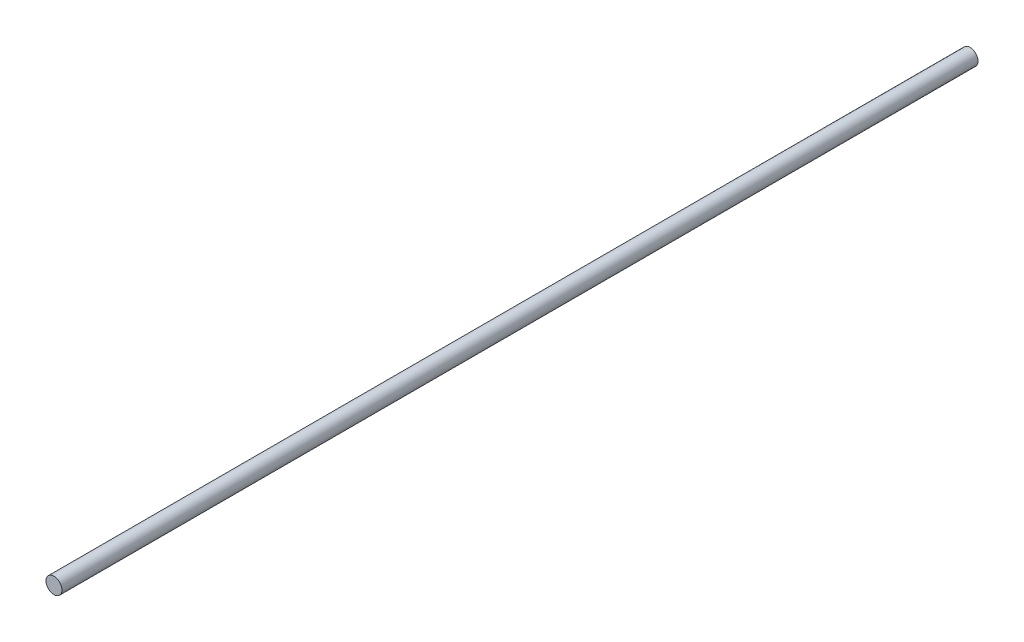
ISO-10303-21;
HEADER;
FILE_DESCRIPTION(('STEP AP214'),'2;1');
FILE_NAME('part.step','',(''),(''),'','','');
FILE_SCHEMA(('AUTOMOTIVE_DESIGN { 1 0 10303 214 1 1 1 1 }'));
ENDSEC;
DATA;
#1=APPLICATION_CONTEXT('core data for automotive mechanical design processes');
#2=APPLICATION_PROTOCOL_DEFINITION('international standard','automotive_design',2000,#1);
#3=PRODUCT_CONTEXT('',#1,'mechanical');
#4=PRODUCT('Part','Part','',(#3));
#5=PRODUCT_RELATED_PRODUCT_CATEGORY('part','',(#4));
#6=PRODUCT_DEFINITION_FORMATION('','',#4);
#7=PRODUCT_DEFINITION_CONTEXT('part definition',#1,'design');
#8=PRODUCT_DEFINITION('design','',#6,#7);
#9=PRODUCT_DEFINITION_SHAPE('','',#8);
#10=(LENGTH_UNIT() NAMED_UNIT(*) SI_UNIT(.MILLI.,.METRE.));
#11=(NAMED_UNIT(*) PLANE_ANGLE_UNIT() SI_UNIT($,.RADIAN.));
#12=(NAMED_UNIT(*) SI_UNIT($,.STERADIAN.) SOLID_ANGLE_UNIT());
#13=UNCERTAINTY_MEASURE_WITH_UNIT(LENGTH_MEASURE(1.E-05),#10,'distance_accuracy_value','');
#14=(GEOMETRIC_REPRESENTATION_CONTEXT(3) GLOBAL_UNCERTAINTY_ASSIGNED_CONTEXT((#13)) GLOBAL_UNIT_ASSIGNED_CONTEXT((#10,
#11,#12)) REPRESENTATION_CONTEXT('',''));
#15=CARTESIAN_POINT('',(0.,0.,0.));
#16=DIRECTION('',(0.,0.,1.));
#17=DIRECTION('',(1.,0.,0.));
#18=AXIS2_PLACEMENT_3D('',#15,#16,#17);
#19=CARTESIAN_POINT('',(0.,0.,-401.));
#20=DIRECTION('',(0.,0.,1.));
#21=DIRECTION('',(1.,0.,0.));
#22=AXIS2_PLACEMENT_3D('',#19,#20,#21);
#23=CYLINDRICAL_SURFACE('',#22,3.5);
#24=CARTESIAN_POINT('',(0.,0.,-401.));
#25=DIRECTION('',(0.,0.,1.));
#26=DIRECTION('',(1.,0.,0.));
#27=AXIS2_PLACEMENT_3D('',#24,#25,#26);
#28=CIRCLE('',#27,3.5);
#29=CARTESIAN_POINT('',(3.5,0.,-401.));
#30=VERTEX_POINT('',#29);
#31=EDGE_CURVE('E10',#30,#30,#28,.T.);
#32=CARTESIAN_POINT('',(0.,0.,0.));
#33=DIRECTION('',(0.,0.,1.));
#34=DIRECTION('',(1.,0.,0.));
#35=AXIS2_PLACEMENT_3D('',#32,#33,#34);
#36=CIRCLE('',#35,3.5);
#37=CARTESIAN_POINT('',(3.5,0.,0.));
#38=VERTEX_POINT('',#37);
#39=EDGE_CURVE('E34',#38,#38,#36,.T.);
#40=CARTESIAN_POINT('',(3.5,0.,-401.));
#41=CARTESIAN_POINT('',(3.5,0.,-396.822916666667));
#42=CARTESIAN_POINT('',(3.5,0.,-392.645833333333));
#43=CARTESIAN_POINT('',(3.5,0.,-384.291666666667));
#44=CARTESIAN_POINT('',(3.5,0.,-380.114583333333));
#45=CARTESIAN_POINT('',(3.5,0.,-371.760416666667));
#46=CARTESIAN_POINT('',(3.5,0.,-367.583333333333));
#47=CARTESIAN_POINT('',(3.5,0.,-359.229166666667));
#48=CARTESIAN_POINT('',(3.5,0.,-355.052083333333));
#49=CARTESIAN_POINT('',(3.5,0.,-346.697916666667));
#50=CARTESIAN_POINT('',(3.5,0.,-342.520833333333));
#51=CARTESIAN_POINT('',(3.5,0.,-334.166666666667));
#52=CARTESIAN_POINT('',(3.5,0.,-329.989583333333));
#53=CARTESIAN_POINT('',(3.5,0.,-321.635416666667));
#54=CARTESIAN_POINT('',(3.5,0.,-317.458333333333));
#55=CARTESIAN_POINT('',(3.5,0.,-309.104166666667));
#56=CARTESIAN_POINT('',(3.5,0.,-304.927083333333));
#57=CARTESIAN_POINT('',(3.5,0.,-296.572916666667));
#58=CARTESIAN_POINT('',(3.5,0.,-292.395833333333));
#59=CARTESIAN_POINT('',(3.5,0.,-284.041666666667));
#60=CARTESIAN_POINT('',(3.5,0.,-279.864583333333));
#61=CARTESIAN_POINT('',(3.5,0.,-271.510416666667));
#62=CARTESIAN_POINT('',(3.5,0.,-267.333333333333));
#63=CARTESIAN_POINT('',(3.5,0.,-258.979166666667));
#64=CARTESIAN_POINT('',(3.5,0.,-254.802083333333));
#65=CARTESIAN_POINT('',(3.5,0.,-246.447916666667));
#66=CARTESIAN_POINT('',(3.5,0.,-242.270833333333));
#67=CARTESIAN_POINT('',(3.5,0.,-233.916666666667));
#68=CARTESIAN_POINT('',(3.5,0.,-229.739583333333));
#69=CARTESIAN_POINT('',(3.5,0.,-221.385416666667));
#70=CARTESIAN_POINT('',(3.5,0.,-217.208333333333));
#71=CARTESIAN_POINT('',(3.5,0.,-208.854166666667));
#72=CARTESIAN_POINT('',(3.5,0.,-204.677083333333));
#73=CARTESIAN_POINT('',(3.5,0.,-196.322916666667));
#74=CARTESIAN_POINT('',(3.5,0.,-192.145833333333));
#75=CARTESIAN_POINT('',(3.5,0.,-183.791666666667));
#76=CARTESIAN_POINT('',(3.5,0.,-179.614583333333));
#77=CARTESIAN_POINT('',(3.5,0.,-171.260416666667));
#78=CARTESIAN_POINT('',(3.5,0.,-167.083333333333));
#79=CARTESIAN_POINT('',(3.5,0.,-158.729166666667));
#80=CARTESIAN_POINT('',(3.5,0.,-154.552083333333));
#81=CARTESIAN_POINT('',(3.5,0.,-146.197916666667));
#82=CARTESIAN_POINT('',(3.5,0.,-142.020833333333));
#83=CARTESIAN_POINT('',(3.5,0.,-133.666666666667));
#84=CARTESIAN_POINT('',(3.5,0.,-129.489583333333));
#85=CARTESIAN_POINT('',(3.5,0.,-121.135416666667));
#86=CARTESIAN_POINT('',(3.5,0.,-116.958333333333));
#87=CARTESIAN_POINT('',(3.5,0.,-108.604166666667));
#88=CARTESIAN_POINT('',(3.5,0.,-104.427083333333));
#89=CARTESIAN_POINT('',(3.5,0.,-96.0729166666667));
#90=CARTESIAN_POINT('',(3.5,0.,-91.8958333333334));
#91=CARTESIAN_POINT('',(3.5,0.,-83.5416666666667));
#92=CARTESIAN_POINT('',(3.5,0.,-79.3645833333334));
#93=CARTESIAN_POINT('',(3.5,0.,-71.0104166666667));
#94=CARTESIAN_POINT('',(3.5,0.,-66.8333333333334));
#95=CARTESIAN_POINT('',(3.5,0.,-58.4791666666667));
#96=CARTESIAN_POINT('',(3.5,0.,-54.3020833333334));
#97=CARTESIAN_POINT('',(3.5,0.,-45.9479166666667));
#98=CARTESIAN_POINT('',(3.5,0.,-41.7708333333334));
#99=CARTESIAN_POINT('',(3.5,0.,-33.4166666666667));
#100=CARTESIAN_POINT('',(3.5,0.,-29.2395833333334));
#101=CARTESIAN_POINT('',(3.5,0.,-20.8854166666667));
#102=CARTESIAN_POINT('',(3.5,0.,-16.7083333333334));
#103=CARTESIAN_POINT('',(3.5,0.,-8.35416666666672));
#104=CARTESIAN_POINT('',(3.5,0.,-4.17708333333339));
#105=CARTESIAN_POINT('',(3.5,0.,0.));
#106=B_SPLINE_CURVE_WITH_KNOTS('',3,(#40,#41,#42,#43,#44,#45,#46,#47,#48,#49,#50,#51,#52,#53,
#54,#55,#56,#57,#58,#59,#60,#61,#62,#63,#64,#65,#66,#67,#68,#69,#70,#71,#72,#73,#74,#75,#76,#77,
#78,#79,#80,#81,#82,#83,#84,#85,#86,#87,#88,#89,#90,#91,#92,#93,#94,#95,#96,#97,#98,#99,#100,
#101,#102,#103,#104,#105),.UNSPECIFIED.,.F.,.F.,(4,2,2,2,2,2,2,2,2,2,2,2,2,2,2,2,2,2,2,2,2,2,2,
2,2,2,2,2,2,2,2,2,4),(0.,12.53125,25.0625,37.59375,50.125,62.65625,75.1875,87.71875,100.25,
112.78125,125.3125,137.84375,150.375,162.90625,175.4375,187.96875,200.5,213.03125,225.5625,
238.09375,250.625,263.15625,275.6875,288.21875,300.75,313.28125,325.8125,338.34375,350.875,
363.40625,375.9375,388.46875,401.),.UNSPECIFIED.);
#107=EDGE_CURVE('BSEAM31',#30,#38,#106,.T.);
#108=ORIENTED_EDGE('',*,*,#31,.T.);
#109=ORIENTED_EDGE('',*,*,#39,.F.);
#110=ORIENTED_EDGE('',*,*,#107,.T.);
#111=ORIENTED_EDGE('',*,*,#107,.F.);
#112=EDGE_LOOP('',(#108,#110,#109,#111));
#113=FACE_BOUND('',#112,.T.);
#114=ADVANCED_FACE('F31',(#113),#23,.T.);
#115=CARTESIAN_POINT('',(0.,0.,-401.));
#116=DIRECTION('',(0.,0.,1.));
#117=DIRECTION('',(1.,0.,0.));
#118=AXIS2_PLACEMENT_3D('',#115,#116,#117);
#119=PLANE('',#118);
#120=ORIENTED_EDGE('',*,*,#31,.F.);
#121=EDGE_LOOP('',(#120));
#122=FACE_BOUND('',#121,.T.);
#123=ADVANCED_FACE('F46',(#122),#119,.F.);
#124=CARTESIAN_POINT('',(0.,0.,0.));
#125=DIRECTION('',(0.,0.,1.));
#126=DIRECTION('',(1.,0.,0.));
#127=AXIS2_PLACEMENT_3D('',#124,#125,#126);
#128=PLANE('',#127);
#129=ORIENTED_EDGE('',*,*,#39,.T.);
#130=EDGE_LOOP('',(#129));
#131=FACE_BOUND('',#130,.T.);
#132=ADVANCED_FACE('F43',(#131),#128,.T.);
#133=CLOSED_SHELL('',(#114,#123,#132));
#134=MANIFOLD_SOLID_BREP('B2',#133);
#135=ADVANCED_BREP_SHAPE_REPRESENTATION('',(#18,#134),#14);
#136=SHAPE_DEFINITION_REPRESENTATION(#9,#135);
ENDSEC;
END-ISO-10303-21;
